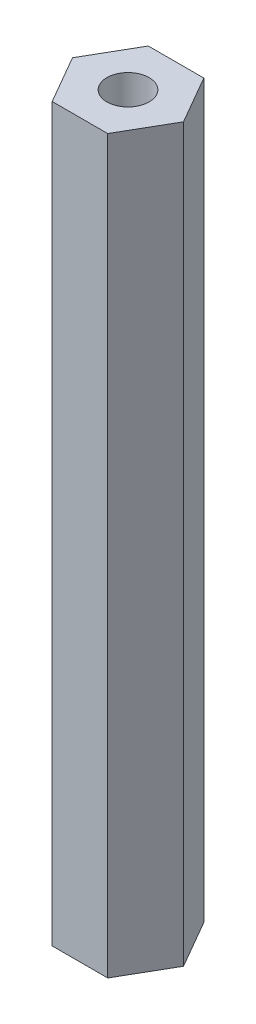
ISO-10303-21;
HEADER;
FILE_DESCRIPTION(('STEP AP214'),'2;1');
FILE_NAME('part.step','',(''),(''),'','','');
FILE_SCHEMA(('AUTOMOTIVE_DESIGN { 1 0 10303 214 1 1 1 1 }'));
ENDSEC;
DATA;
#1=APPLICATION_CONTEXT('core data for automotive mechanical design processes');
#2=APPLICATION_PROTOCOL_DEFINITION('international standard','automotive_design',2000,#1);
#3=PRODUCT_CONTEXT('',#1,'mechanical');
#4=PRODUCT('Part','Part','',(#3));
#5=PRODUCT_RELATED_PRODUCT_CATEGORY('part','',(#4));
#6=PRODUCT_DEFINITION_FORMATION('','',#4);
#7=PRODUCT_DEFINITION_CONTEXT('part definition',#1,'design');
#8=PRODUCT_DEFINITION('design','',#6,#7);
#9=PRODUCT_DEFINITION_SHAPE('','',#8);
#10=(LENGTH_UNIT() NAMED_UNIT(*) SI_UNIT(.MILLI.,.METRE.));
#11=(NAMED_UNIT(*) PLANE_ANGLE_UNIT() SI_UNIT($,.RADIAN.));
#12=(NAMED_UNIT(*) SI_UNIT($,.STERADIAN.) SOLID_ANGLE_UNIT());
#13=UNCERTAINTY_MEASURE_WITH_UNIT(LENGTH_MEASURE(1.E-05),#10,'distance_accuracy_value','');
#14=(GEOMETRIC_REPRESENTATION_CONTEXT(3) GLOBAL_UNCERTAINTY_ASSIGNED_CONTEXT((#13)) GLOBAL_UNIT_ASSIGNED_CONTEXT((#10,
#11,#12)) REPRESENTATION_CONTEXT('',''));
#15=CARTESIAN_POINT('',(0.,0.,0.));
#16=DIRECTION('',(0.,0.,1.));
#17=DIRECTION('',(1.,0.,0.));
#18=AXIS2_PLACEMENT_3D('',#15,#16,#17);
#19=CARTESIAN_POINT('',(1.86974884677061,49.276,3.23850000000001));
#20=DIRECTION('',(0.,1.,0.));
#21=DIRECTION('',(0.,0.,1.));
#22=AXIS2_PLACEMENT_3D('',#19,#20,#21);
#23=PLANE('',#22);
#24=DIRECTION('',(1.,0.,0.));
#25=VECTOR('',#24,1.);
#26=CARTESIAN_POINT('',(-1.86974884677061,49.276,3.23850000000001));
#27=LINE('',#26,#25);
#28=CARTESIAN_POINT('',(-1.86974884677061,49.276,3.23850000000001));
#29=VERTEX_POINT('',#28);
#30=CARTESIAN_POINT('',(1.86974884677061,49.276,3.23850000000001));
#31=VERTEX_POINT('',#30);
#32=EDGE_CURVE('E132',#29,#31,#27,.T.);
#33=ORIENTED_EDGE('',*,*,#32,.T.);
#34=DIRECTION('',(0.5,0.,-0.866025403784439));
#35=VECTOR('',#34,1.);
#36=CARTESIAN_POINT('',(1.86974884677061,49.276,3.23850000000001));
#37=LINE('',#36,#35);
#38=CARTESIAN_POINT('',(3.73949769354121,49.276,0.));
#39=VERTEX_POINT('',#38);
#40=EDGE_CURVE('E90',#31,#39,#37,.T.);
#41=ORIENTED_EDGE('',*,*,#40,.T.);
#42=DIRECTION('',(-0.5,0.,-0.866025403784439));
#43=VECTOR('',#42,1.);
#44=CARTESIAN_POINT('',(3.73949769354121,49.276,0.));
#45=LINE('',#44,#43);
#46=CARTESIAN_POINT('',(1.86974884677061,49.276,-3.23850000000001));
#47=VERTEX_POINT('',#46);
#48=EDGE_CURVE('E103',#39,#47,#45,.T.);
#49=ORIENTED_EDGE('',*,*,#48,.T.);
#50=DIRECTION('',(-1.,0.,0.));
#51=VECTOR('',#50,1.);
#52=CARTESIAN_POINT('',(1.86974884677061,49.276,-3.23850000000001));
#53=LINE('',#52,#51);
#54=CARTESIAN_POINT('',(-1.86974884677061,49.276,-3.23850000000001));
#55=VERTEX_POINT('',#54);
#56=EDGE_CURVE('E97',#47,#55,#53,.T.);
#57=ORIENTED_EDGE('',*,*,#56,.T.);
#58=DIRECTION('',(-0.5,0.,0.866025403784439));
#59=VECTOR('',#58,1.);
#60=CARTESIAN_POINT('',(-1.86974884677061,49.276,-3.23850000000001));
#61=LINE('',#60,#59);
#62=CARTESIAN_POINT('',(-3.73949769354121,49.276,0.));
#63=VERTEX_POINT('',#62);
#64=EDGE_CURVE('E101',#55,#63,#61,.T.);
#65=ORIENTED_EDGE('',*,*,#64,.T.);
#66=DIRECTION('',(0.5,0.,0.866025403784439));
#67=VECTOR('',#66,1.);
#68=CARTESIAN_POINT('',(-3.73949769354121,49.276,0.));
#69=LINE('',#68,#67);
#70=EDGE_CURVE('E53',#63,#29,#69,.T.);
#71=ORIENTED_EDGE('',*,*,#70,.T.);
#72=EDGE_LOOP('',(#33,#41,#49,#57,#65,#71));
#73=FACE_BOUND('',#72,.T.);
#74=CARTESIAN_POINT('',(0.,49.276,0.));
#75=DIRECTION('',(0.,1.,0.));
#76=DIRECTION('',(0.,0.,1.));
#77=AXIS2_PLACEMENT_3D('',#74,#75,#76);
#78=CIRCLE('',#77,1.4224);
#79=CARTESIAN_POINT('',(0.,49.276,-1.4224));
#80=VERTEX_POINT('',#79);
#81=EDGE_CURVE('E125',#80,#80,#78,.T.);
#82=ORIENTED_EDGE('',*,*,#81,.F.);
#83=EDGE_LOOP('',(#82));
#84=FACE_BOUND('',#83,.T.);
#85=ADVANCED_FACE('F36',(#73,#84),#23,.T.);
#86=CARTESIAN_POINT('',(1.86974884677061,0.,3.23850000000001));
#87=DIRECTION('',(0.,1.,0.));
#88=DIRECTION('',(0.,0.,1.));
#89=AXIS2_PLACEMENT_3D('',#86,#87,#88);
#90=PLANE('',#89);
#91=DIRECTION('',(1.,0.,0.));
#92=VECTOR('',#91,1.);
#93=CARTESIAN_POINT('',(-1.86974884677061,0.,3.23850000000001));
#94=LINE('',#93,#92);
#95=CARTESIAN_POINT('',(-1.86974884677061,0.,3.23850000000001));
#96=VERTEX_POINT('',#95);
#97=CARTESIAN_POINT('',(1.86974884677061,0.,3.23850000000001));
#98=VERTEX_POINT('',#97);
#99=EDGE_CURVE('E121',#96,#98,#94,.T.);
#100=ORIENTED_EDGE('',*,*,#99,.F.);
#101=DIRECTION('',(0.5,0.,0.866025403784439));
#102=VECTOR('',#101,1.);
#103=CARTESIAN_POINT('',(-3.73949769354121,0.,0.));
#104=LINE('',#103,#102);
#105=CARTESIAN_POINT('',(-3.73949769354121,0.,0.));
#106=VERTEX_POINT('',#105);
#107=EDGE_CURVE('E82',#106,#96,#104,.T.);
#108=ORIENTED_EDGE('',*,*,#107,.F.);
#109=DIRECTION('',(-0.5,0.,0.866025403784439));
#110=VECTOR('',#109,1.);
#111=CARTESIAN_POINT('',(-1.86974884677061,0.,-3.23850000000001));
#112=LINE('',#111,#110);
#113=CARTESIAN_POINT('',(-1.86974884677061,0.,-3.23850000000001));
#114=VERTEX_POINT('',#113);
#115=EDGE_CURVE('E76',#114,#106,#112,.T.);
#116=ORIENTED_EDGE('',*,*,#115,.F.);
#117=DIRECTION('',(-1.,0.,0.));
#118=VECTOR('',#117,1.);
#119=CARTESIAN_POINT('',(1.86974884677061,0.,-3.23850000000001));
#120=LINE('',#119,#118);
#121=CARTESIAN_POINT('',(1.86974884677061,0.,-3.23850000000001));
#122=VERTEX_POINT('',#121);
#123=EDGE_CURVE('E111',#122,#114,#120,.T.);
#124=ORIENTED_EDGE('',*,*,#123,.F.);
#125=DIRECTION('',(-0.5,0.,-0.866025403784439));
#126=VECTOR('',#125,1.);
#127=CARTESIAN_POINT('',(3.73949769354121,0.,0.));
#128=LINE('',#127,#126);
#129=CARTESIAN_POINT('',(3.73949769354121,0.,0.));
#130=VERTEX_POINT('',#129);
#131=EDGE_CURVE('E127',#130,#122,#128,.T.);
#132=ORIENTED_EDGE('',*,*,#131,.F.);
#133=DIRECTION('',(0.5,0.,-0.866025403784439));
#134=VECTOR('',#133,1.);
#135=CARTESIAN_POINT('',(1.86974884677061,0.,3.23850000000001));
#136=LINE('',#135,#134);
#137=EDGE_CURVE('E124',#98,#130,#136,.T.);
#138=ORIENTED_EDGE('',*,*,#137,.F.);
#139=EDGE_LOOP('',(#100,#108,#116,#124,#132,#138));
#140=FACE_BOUND('',#139,.T.);
#141=CARTESIAN_POINT('',(0.,0.,0.));
#142=DIRECTION('',(0.,1.,0.));
#143=DIRECTION('',(0.,0.,1.));
#144=AXIS2_PLACEMENT_3D('',#141,#142,#143);
#145=CIRCLE('',#144,1.4224);
#146=CARTESIAN_POINT('',(0.,0.,-1.4224));
#147=VERTEX_POINT('',#146);
#148=EDGE_CURVE('E225',#147,#147,#145,.T.);
#149=ORIENTED_EDGE('',*,*,#148,.T.);
#150=EDGE_LOOP('',(#149));
#151=FACE_BOUND('',#150,.T.);
#152=ADVANCED_FACE('F141',(#140,#151),#90,.F.);
#153=CARTESIAN_POINT('',(-1.86974884677061,49.276,3.23850000000001));
#154=DIRECTION('',(0.,0.,-1.));
#155=DIRECTION('',(-1.,0.,0.));
#156=AXIS2_PLACEMENT_3D('',#153,#154,#155);
#157=PLANE('',#156);
#158=ORIENTED_EDGE('',*,*,#99,.T.);
#159=DIRECTION('',(0.,-1.,0.));
#160=VECTOR('',#159,1.);
#161=CARTESIAN_POINT('',(1.86974884677061,49.276,3.23850000000001));
#162=LINE('',#161,#160);
#163=EDGE_CURVE('E11',#31,#98,#162,.T.);
#164=ORIENTED_EDGE('',*,*,#163,.F.);
#165=ORIENTED_EDGE('',*,*,#32,.F.);
#166=DIRECTION('',(0.,-1.,0.));
#167=VECTOR('',#166,1.);
#168=CARTESIAN_POINT('',(-1.86974884677061,49.276,3.23850000000001));
#169=LINE('',#168,#167);
#170=EDGE_CURVE('E117',#29,#96,#169,.T.);
#171=ORIENTED_EDGE('',*,*,#170,.T.);
#172=EDGE_LOOP('',(#158,#164,#165,#171));
#173=FACE_BOUND('',#172,.T.);
#174=ADVANCED_FACE('F38',(#173),#157,.F.);
#175=CARTESIAN_POINT('',(1.86974884677061,49.276,3.23850000000001));
#176=DIRECTION('',(-0.866025403784439,0.,-0.5));
#177=DIRECTION('',(-0.5,0.,0.866025403784439));
#178=AXIS2_PLACEMENT_3D('',#175,#176,#177);
#179=PLANE('',#178);
#180=ORIENTED_EDGE('',*,*,#137,.T.);
#181=DIRECTION('',(0.,-1.,0.));
#182=VECTOR('',#181,1.);
#183=CARTESIAN_POINT('',(3.73949769354121,49.276,0.));
#184=LINE('',#183,#182);
#185=EDGE_CURVE('E45',#39,#130,#184,.T.);
#186=ORIENTED_EDGE('',*,*,#185,.F.);
#187=ORIENTED_EDGE('',*,*,#40,.F.);
#188=ORIENTED_EDGE('',*,*,#163,.T.);
#189=EDGE_LOOP('',(#180,#186,#187,#188));
#190=FACE_BOUND('',#189,.T.);
#191=ADVANCED_FACE('F166',(#190),#179,.F.);
#192=CARTESIAN_POINT('',(3.73949769354121,49.276,0.));
#193=DIRECTION('',(-0.866025403784439,0.,0.5));
#194=DIRECTION('',(0.5,0.,0.866025403784439));
#195=AXIS2_PLACEMENT_3D('',#192,#193,#194);
#196=PLANE('',#195);
#197=ORIENTED_EDGE('',*,*,#131,.T.);
#198=DIRECTION('',(0.,-1.,0.));
#199=VECTOR('',#198,1.);
#200=CARTESIAN_POINT('',(1.86974884677061,49.276,-3.23850000000001));
#201=LINE('',#200,#199);
#202=EDGE_CURVE('E112',#47,#122,#201,.T.);
#203=ORIENTED_EDGE('',*,*,#202,.F.);
#204=ORIENTED_EDGE('',*,*,#48,.F.);
#205=ORIENTED_EDGE('',*,*,#185,.T.);
#206=EDGE_LOOP('',(#197,#203,#204,#205));
#207=FACE_BOUND('',#206,.T.);
#208=ADVANCED_FACE('F138',(#207),#196,.F.);
#209=CARTESIAN_POINT('',(1.86974884677061,49.276,-3.23850000000001));
#210=DIRECTION('',(0.,0.,1.));
#211=DIRECTION('',(1.,0.,0.));
#212=AXIS2_PLACEMENT_3D('',#209,#210,#211);
#213=PLANE('',#212);
#214=ORIENTED_EDGE('',*,*,#123,.T.);
#215=DIRECTION('',(0.,-1.,0.));
#216=VECTOR('',#215,1.);
#217=CARTESIAN_POINT('',(-1.86974884677061,49.276,-3.23850000000001));
#218=LINE('',#217,#216);
#219=EDGE_CURVE('E108',#55,#114,#218,.T.);
#220=ORIENTED_EDGE('',*,*,#219,.F.);
#221=ORIENTED_EDGE('',*,*,#56,.F.);
#222=ORIENTED_EDGE('',*,*,#202,.T.);
#223=EDGE_LOOP('',(#214,#220,#221,#222));
#224=FACE_BOUND('',#223,.T.);
#225=ADVANCED_FACE('F109',(#224),#213,.F.);
#226=CARTESIAN_POINT('',(-1.86974884677061,49.276,-3.23850000000001));
#227=DIRECTION('',(0.866025403784439,0.,0.5));
#228=DIRECTION('',(0.5,0.,-0.866025403784439));
#229=AXIS2_PLACEMENT_3D('',#226,#227,#228);
#230=PLANE('',#229);
#231=ORIENTED_EDGE('',*,*,#115,.T.);
#232=DIRECTION('',(0.,-1.,0.));
#233=VECTOR('',#232,1.);
#234=CARTESIAN_POINT('',(-3.73949769354121,49.276,0.));
#235=LINE('',#234,#233);
#236=EDGE_CURVE('E113',#63,#106,#235,.T.);
#237=ORIENTED_EDGE('',*,*,#236,.F.);
#238=ORIENTED_EDGE('',*,*,#64,.F.);
#239=ORIENTED_EDGE('',*,*,#219,.T.);
#240=EDGE_LOOP('',(#231,#237,#238,#239));
#241=FACE_BOUND('',#240,.T.);
#242=ADVANCED_FACE('F115',(#241),#230,.F.);
#243=CARTESIAN_POINT('',(-3.73949769354121,49.276,0.));
#244=DIRECTION('',(0.866025403784439,0.,-0.5));
#245=DIRECTION('',(-0.5,0.,-0.866025403784439));
#246=AXIS2_PLACEMENT_3D('',#243,#244,#245);
#247=PLANE('',#246);
#248=ORIENTED_EDGE('',*,*,#107,.T.);
#249=ORIENTED_EDGE('',*,*,#170,.F.);
#250=ORIENTED_EDGE('',*,*,#70,.F.);
#251=ORIENTED_EDGE('',*,*,#236,.T.);
#252=EDGE_LOOP('',(#248,#249,#250,#251));
#253=FACE_BOUND('',#252,.T.);
#254=ADVANCED_FACE('F146',(#253),#247,.F.);
#255=CARTESIAN_POINT('',(0.,49.276,0.));
#256=DIRECTION('',(0.,-1.,0.));
#257=DIRECTION('',(0.,0.,-1.));
#258=AXIS2_PLACEMENT_3D('',#255,#256,#257);
#259=CYLINDRICAL_SURFACE('',#258,1.4224);
#260=CARTESIAN_POINT('',(0.,49.276,-1.4224));
#261=CARTESIAN_POINT('',(0.,48.7627083333333,-1.4224));
#262=CARTESIAN_POINT('',(0.,48.2494166666667,-1.4224));
#263=CARTESIAN_POINT('',(0.,47.2228333333333,-1.4224));
#264=CARTESIAN_POINT('',(0.,46.7095416666667,-1.4224));
#265=CARTESIAN_POINT('',(0.,45.6829583333333,-1.4224));
#266=CARTESIAN_POINT('',(0.,45.1696666666667,-1.4224));
#267=CARTESIAN_POINT('',(0.,44.1430833333333,-1.4224));
#268=CARTESIAN_POINT('',(0.,43.6297916666667,-1.4224));
#269=CARTESIAN_POINT('',(0.,42.6032083333333,-1.4224));
#270=CARTESIAN_POINT('',(0.,42.0899166666667,-1.4224));
#271=CARTESIAN_POINT('',(0.,41.0633333333333,-1.4224));
#272=CARTESIAN_POINT('',(0.,40.5500416666667,-1.4224));
#273=CARTESIAN_POINT('',(0.,39.5234583333333,-1.4224));
#274=CARTESIAN_POINT('',(0.,39.0101666666667,-1.4224));
#275=CARTESIAN_POINT('',(0.,37.9835833333333,-1.4224));
#276=CARTESIAN_POINT('',(0.,37.4702916666667,-1.4224));
#277=CARTESIAN_POINT('',(0.,36.4437083333333,-1.4224));
#278=CARTESIAN_POINT('',(0.,35.9304166666667,-1.4224));
#279=CARTESIAN_POINT('',(0.,34.9038333333333,-1.4224));
#280=CARTESIAN_POINT('',(0.,34.3905416666667,-1.4224));
#281=CARTESIAN_POINT('',(0.,33.3639583333333,-1.4224));
#282=CARTESIAN_POINT('',(0.,32.8506666666667,-1.4224));
#283=CARTESIAN_POINT('',(0.,31.8240833333333,-1.4224));
#284=CARTESIAN_POINT('',(0.,31.3107916666667,-1.4224));
#285=CARTESIAN_POINT('',(0.,30.2842083333333,-1.4224));
#286=CARTESIAN_POINT('',(0.,29.7709166666667,-1.4224));
#287=CARTESIAN_POINT('',(0.,28.7443333333333,-1.4224));
#288=CARTESIAN_POINT('',(0.,28.2310416666667,-1.4224));
#289=CARTESIAN_POINT('',(0.,27.2044583333333,-1.4224));
#290=CARTESIAN_POINT('',(0.,26.6911666666667,-1.4224));
#291=CARTESIAN_POINT('',(0.,25.6645833333333,-1.4224));
#292=CARTESIAN_POINT('',(0.,25.1512916666667,-1.4224));
#293=CARTESIAN_POINT('',(0.,24.1247083333333,-1.4224));
#294=CARTESIAN_POINT('',(0.,23.6114166666667,-1.4224));
#295=CARTESIAN_POINT('',(0.,22.5848333333333,-1.4224));
#296=CARTESIAN_POINT('',(0.,22.0715416666667,-1.4224));
#297=CARTESIAN_POINT('',(0.,21.0449583333333,-1.4224));
#298=CARTESIAN_POINT('',(0.,20.5316666666667,-1.4224));
#299=CARTESIAN_POINT('',(0.,19.5050833333333,-1.4224));
#300=CARTESIAN_POINT('',(0.,18.9917916666667,-1.4224));
#301=CARTESIAN_POINT('',(0.,17.9652083333333,-1.4224));
#302=CARTESIAN_POINT('',(0.,17.4519166666667,-1.4224));
#303=CARTESIAN_POINT('',(0.,16.4253333333333,-1.4224));
#304=CARTESIAN_POINT('',(0.,15.9120416666667,-1.4224));
#305=CARTESIAN_POINT('',(0.,14.8854583333333,-1.4224));
#306=CARTESIAN_POINT('',(0.,14.3721666666667,-1.4224));
#307=CARTESIAN_POINT('',(0.,13.3455833333333,-1.4224));
#308=CARTESIAN_POINT('',(0.,12.8322916666667,-1.4224));
#309=CARTESIAN_POINT('',(0.,11.8057083333333,-1.4224));
#310=CARTESIAN_POINT('',(0.,11.2924166666667,-1.4224));
#311=CARTESIAN_POINT('',(0.,10.2658333333333,-1.4224));
#312=CARTESIAN_POINT('',(0.,9.75254166666666,-1.4224));
#313=CARTESIAN_POINT('',(0.,8.72595833333333,-1.4224));
#314=CARTESIAN_POINT('',(0.,8.21266666666666,-1.4224));
#315=CARTESIAN_POINT('',(0.,7.18608333333333,-1.4224));
#316=CARTESIAN_POINT('',(0.,6.67279166666666,-1.4224));
#317=CARTESIAN_POINT('',(0.,5.64620833333333,-1.4224));
#318=CARTESIAN_POINT('',(0.,5.13291666666666,-1.4224));
#319=CARTESIAN_POINT('',(0.,4.10633333333333,-1.4224));
#320=CARTESIAN_POINT('',(0.,3.59304166666666,-1.4224));
#321=CARTESIAN_POINT('',(0.,2.56645833333333,-1.4224));
#322=CARTESIAN_POINT('',(0.,2.05316666666666,-1.4224));
#323=CARTESIAN_POINT('',(0.,1.02658333333333,-1.4224));
#324=CARTESIAN_POINT('',(0.,0.513291666666661,-1.4224));
#325=CARTESIAN_POINT('',(0.,0.,-1.4224));
#326=B_SPLINE_CURVE_WITH_KNOTS('',3,(#260,#261,#262,#263,#264,#265,#266,#267,#268,#269,#270,
#271,#272,#273,#274,#275,#276,#277,#278,#279,#280,#281,#282,#283,#284,#285,#286,#287,#288,#289,
#290,#291,#292,#293,#294,#295,#296,#297,#298,#299,#300,#301,#302,#303,#304,#305,#306,#307,#308,
#309,#310,#311,#312,#313,#314,#315,#316,#317,#318,#319,#320,#321,#322,#323,#324,#325),
.UNSPECIFIED.,.F.,.F.,(4,2,2,2,2,2,2,2,2,2,2,2,2,2,2,2,2,2,2,2,2,2,2,2,2,2,2,2,2,2,2,2,4),(0.,
1.539875,3.07975000000001,4.619625,6.1595,7.69937500000001,9.23925,10.779125,12.319,13.858875,
15.39875,16.938625,18.4785,20.018375,21.55825,23.098125,24.638,26.177875,27.71775,29.257625,
30.7975,32.337375,33.87725,35.417125,36.957,38.496875,40.03675,41.576625,43.1165,44.656375,
46.19625,47.736125,49.276),.UNSPECIFIED.);
#327=EDGE_CURVE('BSEAM148',#80,#147,#326,.T.);
#328=ORIENTED_EDGE('',*,*,#81,.T.);
#329=ORIENTED_EDGE('',*,*,#148,.F.);
#330=ORIENTED_EDGE('',*,*,#327,.T.);
#331=ORIENTED_EDGE('',*,*,#327,.F.);
#332=EDGE_LOOP('',(#328,#330,#329,#331));
#333=FACE_BOUND('',#332,.T.);
#334=ADVANCED_FACE('F148',(#333),#259,.F.);
#335=CLOSED_SHELL('',(#85,#152,#174,#191,#208,#225,#242,#254,#334));
#336=MANIFOLD_SOLID_BREP('B2',#335);
#337=ADVANCED_BREP_SHAPE_REPRESENTATION('',(#18,#336),#14);
#338=SHAPE_DEFINITION_REPRESENTATION(#9,#337);
ENDSEC;
END-ISO-10303-21;
